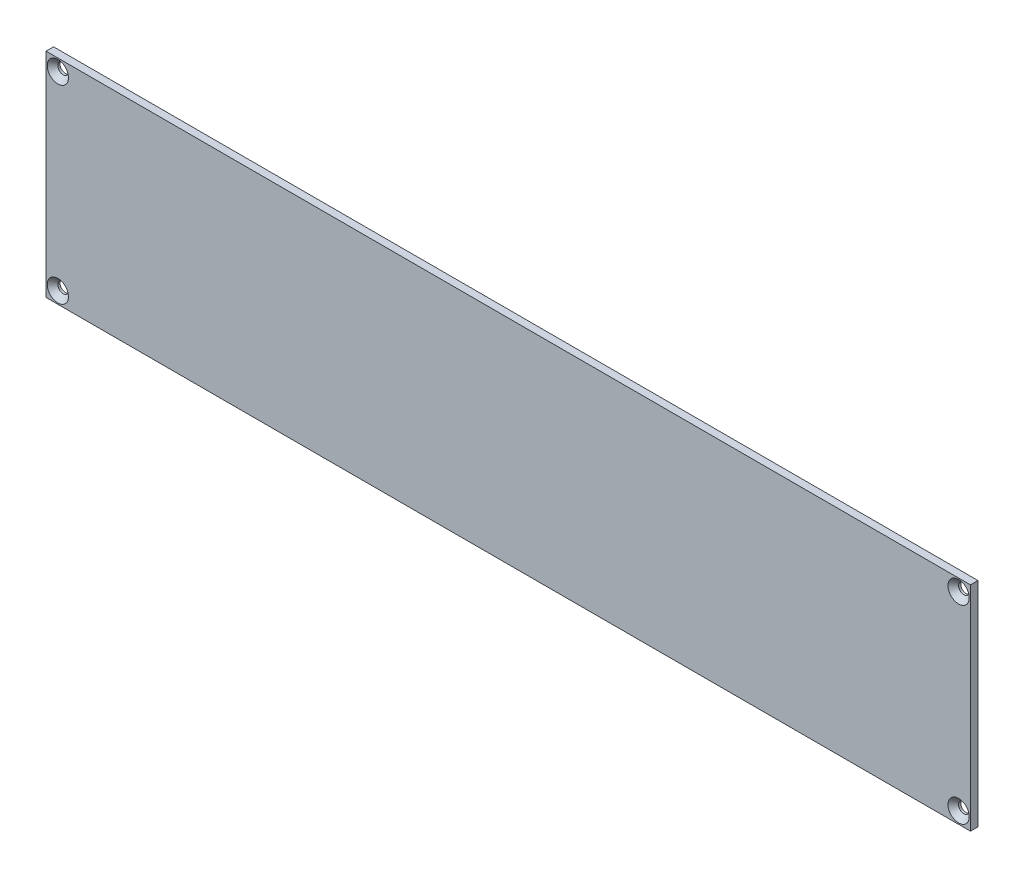
ISO-10303-21;
HEADER;
FILE_DESCRIPTION(('STEP AP214'),'2;1');
FILE_NAME('part.step','',(''),(''),'','','');
FILE_SCHEMA(('AUTOMOTIVE_DESIGN { 1 0 10303 214 1 1 1 1 }'));
ENDSEC;
DATA;
#1=APPLICATION_CONTEXT('core data for automotive mechanical design processes');
#2=APPLICATION_PROTOCOL_DEFINITION('international standard','automotive_design',2000,#1);
#3=PRODUCT_CONTEXT('',#1,'mechanical');
#4=PRODUCT('Part','Part','',(#3));
#5=PRODUCT_RELATED_PRODUCT_CATEGORY('part','',(#4));
#6=PRODUCT_DEFINITION_FORMATION('','',#4);
#7=PRODUCT_DEFINITION_CONTEXT('part definition',#1,'design');
#8=PRODUCT_DEFINITION('design','',#6,#7);
#9=PRODUCT_DEFINITION_SHAPE('','',#8);
#10=(LENGTH_UNIT() NAMED_UNIT(*) SI_UNIT(.MILLI.,.METRE.));
#11=(NAMED_UNIT(*) PLANE_ANGLE_UNIT() SI_UNIT($,.RADIAN.));
#12=(NAMED_UNIT(*) SI_UNIT($,.STERADIAN.) SOLID_ANGLE_UNIT());
#13=UNCERTAINTY_MEASURE_WITH_UNIT(LENGTH_MEASURE(1.E-05),#10,'distance_accuracy_value','');
#14=(GEOMETRIC_REPRESENTATION_CONTEXT(3) GLOBAL_UNCERTAINTY_ASSIGNED_CONTEXT((#13)) GLOBAL_UNIT_ASSIGNED_CONTEXT((#10,
#11,#12)) REPRESENTATION_CONTEXT('',''));
#15=CARTESIAN_POINT('',(0.,0.,0.));
#16=DIRECTION('',(0.,0.,1.));
#17=DIRECTION('',(1.,0.,0.));
#18=AXIS2_PLACEMENT_3D('',#15,#16,#17);
#19=CARTESIAN_POINT('',(195.,-45.,3.175));
#20=DIRECTION('',(-1.,0.,0.));
#21=DIRECTION('',(0.,0.,1.));
#22=AXIS2_PLACEMENT_3D('',#19,#20,#21);
#23=PLANE('',#22);
#24=DIRECTION('',(0.,1.,0.));
#25=VECTOR('',#24,1.);
#26=CARTESIAN_POINT('',(195.,-45.,0.));
#27=LINE('',#26,#25);
#28=CARTESIAN_POINT('',(195.,-45.,0.));
#29=VERTEX_POINT('',#28);
#30=CARTESIAN_POINT('',(195.,45.,0.));
#31=VERTEX_POINT('',#30);
#32=EDGE_CURVE('E107',#29,#31,#27,.T.);
#33=ORIENTED_EDGE('',*,*,#32,.T.);
#34=DIRECTION('',(0.,0.,-1.));
#35=VECTOR('',#34,1.);
#36=CARTESIAN_POINT('',(195.,45.,3.175));
#37=LINE('',#36,#35);
#38=CARTESIAN_POINT('',(195.,45.,3.175));
#39=VERTEX_POINT('',#38);
#40=EDGE_CURVE('E11',#39,#31,#37,.T.);
#41=ORIENTED_EDGE('',*,*,#40,.F.);
#42=DIRECTION('',(0.,1.,0.));
#43=VECTOR('',#42,1.);
#44=CARTESIAN_POINT('',(195.,-45.,3.175));
#45=LINE('',#44,#43);
#46=CARTESIAN_POINT('',(195.,-45.,3.175));
#47=VERTEX_POINT('',#46);
#48=EDGE_CURVE('E91',#47,#39,#45,.T.);
#49=ORIENTED_EDGE('',*,*,#48,.F.);
#50=DIRECTION('',(0.,0.,-1.));
#51=VECTOR('',#50,1.);
#52=CARTESIAN_POINT('',(195.,-45.,3.175));
#53=LINE('',#52,#51);
#54=EDGE_CURVE('E103',#47,#29,#53,.T.);
#55=ORIENTED_EDGE('',*,*,#54,.T.);
#56=EDGE_LOOP('',(#33,#41,#49,#55));
#57=FACE_BOUND('',#56,.T.);
#58=ADVANCED_FACE('F39',(#57),#23,.F.);
#59=CARTESIAN_POINT('',(-195.,45.,3.175));
#60=DIRECTION('',(0.,-1.,0.));
#61=DIRECTION('',(0.,0.,-1.));
#62=AXIS2_PLACEMENT_3D('',#59,#60,#61);
#63=PLANE('',#62);
#64=DIRECTION('',(-1.,0.,0.));
#65=VECTOR('',#64,1.);
#66=CARTESIAN_POINT('',(-195.,45.,0.));
#67=LINE('',#66,#65);
#68=CARTESIAN_POINT('',(-195.,45.,0.));
#69=VERTEX_POINT('',#68);
#70=EDGE_CURVE('E96',#31,#69,#67,.T.);
#71=ORIENTED_EDGE('',*,*,#70,.T.);
#72=DIRECTION('',(0.,0.,-1.));
#73=VECTOR('',#72,1.);
#74=CARTESIAN_POINT('',(-195.,45.,3.175));
#75=LINE('',#74,#73);
#76=CARTESIAN_POINT('',(-195.,45.,3.175));
#77=VERTEX_POINT('',#76);
#78=EDGE_CURVE('E48',#77,#69,#75,.T.);
#79=ORIENTED_EDGE('',*,*,#78,.F.);
#80=DIRECTION('',(-1.,0.,0.));
#81=VECTOR('',#80,1.);
#82=CARTESIAN_POINT('',(-195.,45.,3.175));
#83=LINE('',#82,#81);
#84=EDGE_CURVE('E86',#39,#77,#83,.T.);
#85=ORIENTED_EDGE('',*,*,#84,.F.);
#86=ORIENTED_EDGE('',*,*,#40,.T.);
#87=EDGE_LOOP('',(#71,#79,#85,#86));
#88=FACE_BOUND('',#87,.T.);
#89=ADVANCED_FACE('F95',(#88),#63,.F.);
#90=CARTESIAN_POINT('',(-195.,-45.,3.175));
#91=DIRECTION('',(1.,0.,0.));
#92=DIRECTION('',(0.,0.,-1.));
#93=AXIS2_PLACEMENT_3D('',#90,#91,#92);
#94=PLANE('',#93);
#95=DIRECTION('',(0.,-1.,0.));
#96=VECTOR('',#95,1.);
#97=CARTESIAN_POINT('',(-195.,-45.,0.));
#98=LINE('',#97,#96);
#99=CARTESIAN_POINT('',(-195.,-45.,0.));
#100=VERTEX_POINT('',#99);
#101=EDGE_CURVE('E73',#69,#100,#98,.T.);
#102=ORIENTED_EDGE('',*,*,#101,.T.);
#103=DIRECTION('',(0.,0.,-1.));
#104=VECTOR('',#103,1.);
#105=CARTESIAN_POINT('',(-195.,-45.,3.175));
#106=LINE('',#105,#104);
#107=CARTESIAN_POINT('',(-195.,-45.,3.175));
#108=VERTEX_POINT('',#107);
#109=EDGE_CURVE('E98',#108,#100,#106,.T.);
#110=ORIENTED_EDGE('',*,*,#109,.F.);
#111=DIRECTION('',(0.,-1.,0.));
#112=VECTOR('',#111,1.);
#113=CARTESIAN_POINT('',(-195.,-45.,3.175));
#114=LINE('',#113,#112);
#115=EDGE_CURVE('E89',#77,#108,#114,.T.);
#116=ORIENTED_EDGE('',*,*,#115,.F.);
#117=ORIENTED_EDGE('',*,*,#78,.T.);
#118=EDGE_LOOP('',(#102,#110,#116,#117));
#119=FACE_BOUND('',#118,.T.);
#120=ADVANCED_FACE('F99',(#119),#94,.F.);
#121=CARTESIAN_POINT('',(-195.,-45.,3.175));
#122=DIRECTION('',(0.,1.,0.));
#123=DIRECTION('',(0.,0.,1.));
#124=AXIS2_PLACEMENT_3D('',#121,#122,#123);
#125=PLANE('',#124);
#126=DIRECTION('',(1.,0.,0.));
#127=VECTOR('',#126,1.);
#128=CARTESIAN_POINT('',(-195.,-45.,0.));
#129=LINE('',#128,#127);
#130=EDGE_CURVE('E79',#100,#29,#129,.T.);
#131=ORIENTED_EDGE('',*,*,#130,.T.);
#132=ORIENTED_EDGE('',*,*,#54,.F.);
#133=DIRECTION('',(1.,0.,0.));
#134=VECTOR('',#133,1.);
#135=CARTESIAN_POINT('',(-195.,-45.,3.175));
#136=LINE('',#135,#134);
#137=EDGE_CURVE('E56',#108,#47,#136,.T.);
#138=ORIENTED_EDGE('',*,*,#137,.F.);
#139=ORIENTED_EDGE('',*,*,#109,.T.);
#140=EDGE_LOOP('',(#131,#132,#138,#139));
#141=FACE_BOUND('',#140,.T.);
#142=ADVANCED_FACE('F121',(#141),#125,.F.);
#143=CARTESIAN_POINT('',(0.,0.,3.175));
#144=DIRECTION('',(0.,0.,-1.));
#145=DIRECTION('',(-1.,0.,0.));
#146=AXIS2_PLACEMENT_3D('',#143,#144,#145);
#147=PLANE('',#146);
#148=CARTESIAN_POINT('',(190.,40.,3.175));
#149=DIRECTION('',(0.,0.,1.));
#150=DIRECTION('',(1.,0.,0.));
#151=AXIS2_PLACEMENT_3D('',#148,#149,#150);
#152=CIRCLE('',#151,4.48000000000001);
#153=CARTESIAN_POINT('',(194.48,40.,3.175));
#154=VERTEX_POINT('',#153);
#155=EDGE_CURVE('E171',#154,#154,#152,.T.);
#156=ORIENTED_EDGE('',*,*,#155,.F.);
#157=EDGE_LOOP('',(#156));
#158=FACE_BOUND('',#157,.T.);
#159=CARTESIAN_POINT('',(-190.,-40.0000000000001,3.175));
#160=DIRECTION('',(0.,0.,1.));
#161=DIRECTION('',(1.,0.,0.));
#162=AXIS2_PLACEMENT_3D('',#159,#160,#161);
#163=CIRCLE('',#162,4.48000000000001);
#164=CARTESIAN_POINT('',(-185.52,-40.0000000000001,3.175));
#165=VERTEX_POINT('',#164);
#166=EDGE_CURVE('E159',#165,#165,#163,.T.);
#167=ORIENTED_EDGE('',*,*,#166,.F.);
#168=EDGE_LOOP('',(#167));
#169=FACE_BOUND('',#168,.T.);
#170=CARTESIAN_POINT('',(-190.,40.,3.175));
#171=DIRECTION('',(0.,0.,1.));
#172=DIRECTION('',(1.,0.,0.));
#173=AXIS2_PLACEMENT_3D('',#170,#171,#172);
#174=CIRCLE('',#173,4.48000000000001);
#175=CARTESIAN_POINT('',(-185.52,40.,3.175));
#176=VERTEX_POINT('',#175);
#177=EDGE_CURVE('E147',#176,#176,#174,.T.);
#178=ORIENTED_EDGE('',*,*,#177,.F.);
#179=EDGE_LOOP('',(#178));
#180=FACE_BOUND('',#179,.T.);
#181=CARTESIAN_POINT('',(190.,-40.0000000000001,3.175));
#182=DIRECTION('',(0.,0.,1.));
#183=DIRECTION('',(1.,0.,0.));
#184=AXIS2_PLACEMENT_3D('',#181,#182,#183);
#185=CIRCLE('',#184,4.48000000000001);
#186=CARTESIAN_POINT('',(194.48,-40.0000000000001,3.175));
#187=VERTEX_POINT('',#186);
#188=EDGE_CURVE('E135',#187,#187,#185,.T.);
#189=ORIENTED_EDGE('',*,*,#188,.F.);
#190=EDGE_LOOP('',(#189));
#191=FACE_BOUND('',#190,.T.);
#192=ORIENTED_EDGE('',*,*,#48,.T.);
#193=ORIENTED_EDGE('',*,*,#84,.T.);
#194=ORIENTED_EDGE('',*,*,#115,.T.);
#195=ORIENTED_EDGE('',*,*,#137,.T.);
#196=EDGE_LOOP('',(#192,#193,#194,#195));
#197=FACE_BOUND('',#196,.T.);
#198=ADVANCED_FACE('F87',(#158,#169,#180,#191,#197),#147,.F.);
#199=CARTESIAN_POINT('',(0.,0.,0.));
#200=DIRECTION('',(0.,0.,-1.));
#201=DIRECTION('',(-1.,0.,0.));
#202=AXIS2_PLACEMENT_3D('',#199,#200,#201);
#203=PLANE('',#202);
#204=CARTESIAN_POINT('',(190.,40.,0.));
#205=DIRECTION('',(0.,0.,1.));
#206=DIRECTION('',(1.,0.,0.));
#207=AXIS2_PLACEMENT_3D('',#204,#205,#206);
#208=CIRCLE('',#207,2.25);
#209=CARTESIAN_POINT('',(192.25,40.,0.));
#210=VERTEX_POINT('',#209);
#211=EDGE_CURVE('E163',#210,#210,#208,.T.);
#212=ORIENTED_EDGE('',*,*,#211,.T.);
#213=EDGE_LOOP('',(#212));
#214=FACE_BOUND('',#213,.T.);
#215=CARTESIAN_POINT('',(-190.,-40.0000000000001,0.));
#216=DIRECTION('',(0.,0.,1.));
#217=DIRECTION('',(1.,0.,0.));
#218=AXIS2_PLACEMENT_3D('',#215,#216,#217);
#219=CIRCLE('',#218,2.25);
#220=CARTESIAN_POINT('',(-187.75,-40.0000000000001,0.));
#221=VERTEX_POINT('',#220);
#222=EDGE_CURVE('E151',#221,#221,#219,.T.);
#223=ORIENTED_EDGE('',*,*,#222,.T.);
#224=EDGE_LOOP('',(#223));
#225=FACE_BOUND('',#224,.T.);
#226=CARTESIAN_POINT('',(-190.,40.,0.));
#227=DIRECTION('',(0.,0.,1.));
#228=DIRECTION('',(1.,0.,0.));
#229=AXIS2_PLACEMENT_3D('',#226,#227,#228);
#230=CIRCLE('',#229,2.25);
#231=CARTESIAN_POINT('',(-187.75,40.,0.));
#232=VERTEX_POINT('',#231);
#233=EDGE_CURVE('E139',#232,#232,#230,.T.);
#234=ORIENTED_EDGE('',*,*,#233,.T.);
#235=EDGE_LOOP('',(#234));
#236=FACE_BOUND('',#235,.T.);
#237=CARTESIAN_POINT('',(190.,-40.0000000000001,0.));
#238=DIRECTION('',(0.,0.,1.));
#239=DIRECTION('',(1.,0.,0.));
#240=AXIS2_PLACEMENT_3D('',#237,#238,#239);
#241=CIRCLE('',#240,2.25);
#242=CARTESIAN_POINT('',(192.25,-40.0000000000001,0.));
#243=VERTEX_POINT('',#242);
#244=EDGE_CURVE('E111',#243,#243,#241,.T.);
#245=ORIENTED_EDGE('',*,*,#244,.T.);
#246=EDGE_LOOP('',(#245));
#247=FACE_BOUND('',#246,.T.);
#248=ORIENTED_EDGE('',*,*,#32,.F.);
#249=ORIENTED_EDGE('',*,*,#130,.F.);
#250=ORIENTED_EDGE('',*,*,#101,.F.);
#251=ORIENTED_EDGE('',*,*,#70,.F.);
#252=EDGE_LOOP('',(#248,#249,#250,#251));
#253=FACE_BOUND('',#252,.T.);
#254=ADVANCED_FACE('F124',(#214,#225,#236,#247,#253),#203,.T.);
#255=CARTESIAN_POINT('',(190.,-40.0000000000001,3.175));
#256=DIRECTION('',(0.,0.,1.));
#257=DIRECTION('',(1.,0.,0.));
#258=AXIS2_PLACEMENT_3D('',#255,#256,#257);
#259=CYLINDRICAL_SURFACE('',#258,2.25);
#260=ORIENTED_EDGE('',*,*,#244,.F.);
#261=EDGE_LOOP('',(#260));
#262=FACE_BOUND('',#261,.T.);
#263=CARTESIAN_POINT('',(190.,-40.0000000000001,0.944999999999999));
#264=DIRECTION('',(0.,0.,1.));
#265=DIRECTION('',(1.,0.,0.));
#266=AXIS2_PLACEMENT_3D('',#263,#264,#265);
#267=CIRCLE('',#266,2.25);
#268=CARTESIAN_POINT('',(192.25,-40.0000000000001,0.944999999999999));
#269=VERTEX_POINT('',#268);
#270=EDGE_CURVE('E131',#269,#269,#267,.T.);
#271=ORIENTED_EDGE('',*,*,#270,.T.);
#272=EDGE_LOOP('',(#271));
#273=FACE_BOUND('',#272,.T.);
#274=ADVANCED_FACE('F190',(#262,#273),#259,.F.);
#275=CARTESIAN_POINT('',(190.,-40.0000000000001,3.175));
#276=DIRECTION('',(0.,0.,1.));
#277=DIRECTION('',(1.,0.,0.));
#278=AXIS2_PLACEMENT_3D('',#275,#276,#277);
#279=CONICAL_SURFACE('',#278,4.48000000000001,0.78539816339745);
#280=ORIENTED_EDGE('',*,*,#270,.F.);
#281=EDGE_LOOP('',(#280));
#282=FACE_BOUND('',#281,.T.);
#283=ORIENTED_EDGE('',*,*,#188,.T.);
#284=EDGE_LOOP('',(#283));
#285=FACE_BOUND('',#284,.T.);
#286=ADVANCED_FACE('F187',(#282,#285),#279,.F.);
#287=CARTESIAN_POINT('',(-190.,40.,3.175));
#288=DIRECTION('',(0.,0.,1.));
#289=DIRECTION('',(1.,0.,0.));
#290=AXIS2_PLACEMENT_3D('',#287,#288,#289);
#291=CYLINDRICAL_SURFACE('',#290,2.25);
#292=ORIENTED_EDGE('',*,*,#233,.F.);
#293=EDGE_LOOP('',(#292));
#294=FACE_BOUND('',#293,.T.);
#295=CARTESIAN_POINT('',(-190.,40.,0.944999999999999));
#296=DIRECTION('',(0.,0.,1.));
#297=DIRECTION('',(1.,0.,0.));
#298=AXIS2_PLACEMENT_3D('',#295,#296,#297);
#299=CIRCLE('',#298,2.25);
#300=CARTESIAN_POINT('',(-187.75,40.,0.944999999999999));
#301=VERTEX_POINT('',#300);
#302=EDGE_CURVE('E143',#301,#301,#299,.T.);
#303=ORIENTED_EDGE('',*,*,#302,.T.);
#304=EDGE_LOOP('',(#303));
#305=FACE_BOUND('',#304,.T.);
#306=ADVANCED_FACE('F189',(#294,#305),#291,.F.);
#307=CARTESIAN_POINT('',(-190.,40.,3.175));
#308=DIRECTION('',(0.,0.,1.));
#309=DIRECTION('',(1.,0.,0.));
#310=AXIS2_PLACEMENT_3D('',#307,#308,#309);
#311=CONICAL_SURFACE('',#310,4.48000000000001,0.78539816339745);
#312=ORIENTED_EDGE('',*,*,#302,.F.);
#313=EDGE_LOOP('',(#312));
#314=FACE_BOUND('',#313,.T.);
#315=ORIENTED_EDGE('',*,*,#177,.T.);
#316=EDGE_LOOP('',(#315));
#317=FACE_BOUND('',#316,.T.);
#318=ADVANCED_FACE('F197',(#314,#317),#311,.F.);
#319=CARTESIAN_POINT('',(-190.,-40.0000000000001,3.175));
#320=DIRECTION('',(0.,0.,1.));
#321=DIRECTION('',(1.,0.,0.));
#322=AXIS2_PLACEMENT_3D('',#319,#320,#321);
#323=CYLINDRICAL_SURFACE('',#322,2.25);
#324=ORIENTED_EDGE('',*,*,#222,.F.);
#325=EDGE_LOOP('',(#324));
#326=FACE_BOUND('',#325,.T.);
#327=CARTESIAN_POINT('',(-190.,-40.0000000000001,0.944999999999999));
#328=DIRECTION('',(0.,0.,1.));
#329=DIRECTION('',(1.,0.,0.));
#330=AXIS2_PLACEMENT_3D('',#327,#328,#329);
#331=CIRCLE('',#330,2.25);
#332=CARTESIAN_POINT('',(-187.75,-40.0000000000001,0.944999999999999));
#333=VERTEX_POINT('',#332);
#334=EDGE_CURVE('E155',#333,#333,#331,.T.);
#335=ORIENTED_EDGE('',*,*,#334,.T.);
#336=EDGE_LOOP('',(#335));
#337=FACE_BOUND('',#336,.T.);
#338=ADVANCED_FACE('F231',(#326,#337),#323,.F.);
#339=CARTESIAN_POINT('',(-190.,-40.0000000000001,3.175));
#340=DIRECTION('',(0.,0.,1.));
#341=DIRECTION('',(1.,0.,0.));
#342=AXIS2_PLACEMENT_3D('',#339,#340,#341);
#343=CONICAL_SURFACE('',#342,4.48000000000001,0.78539816339745);
#344=ORIENTED_EDGE('',*,*,#334,.F.);
#345=EDGE_LOOP('',(#344));
#346=FACE_BOUND('',#345,.T.);
#347=ORIENTED_EDGE('',*,*,#166,.T.);
#348=EDGE_LOOP('',(#347));
#349=FACE_BOUND('',#348,.T.);
#350=ADVANCED_FACE('F236',(#346,#349),#343,.F.);
#351=CARTESIAN_POINT('',(190.,40.,3.175));
#352=DIRECTION('',(0.,0.,1.));
#353=DIRECTION('',(1.,0.,0.));
#354=AXIS2_PLACEMENT_3D('',#351,#352,#353);
#355=CYLINDRICAL_SURFACE('',#354,2.25);
#356=ORIENTED_EDGE('',*,*,#211,.F.);
#357=EDGE_LOOP('',(#356));
#358=FACE_BOUND('',#357,.T.);
#359=CARTESIAN_POINT('',(190.,40.,0.944999999999999));
#360=DIRECTION('',(0.,0.,1.));
#361=DIRECTION('',(1.,0.,0.));
#362=AXIS2_PLACEMENT_3D('',#359,#360,#361);
#363=CIRCLE('',#362,2.25);
#364=CARTESIAN_POINT('',(192.25,40.,0.944999999999999));
#365=VERTEX_POINT('',#364);
#366=EDGE_CURVE('E167',#365,#365,#363,.T.);
#367=ORIENTED_EDGE('',*,*,#366,.T.);
#368=EDGE_LOOP('',(#367));
#369=FACE_BOUND('',#368,.T.);
#370=ADVANCED_FACE('F242',(#358,#369),#355,.F.);
#371=CARTESIAN_POINT('',(190.,40.,3.175));
#372=DIRECTION('',(0.,0.,1.));
#373=DIRECTION('',(1.,0.,0.));
#374=AXIS2_PLACEMENT_3D('',#371,#372,#373);
#375=CONICAL_SURFACE('',#374,4.48000000000001,0.78539816339745);
#376=ORIENTED_EDGE('',*,*,#366,.F.);
#377=EDGE_LOOP('',(#376));
#378=FACE_BOUND('',#377,.T.);
#379=ORIENTED_EDGE('',*,*,#155,.T.);
#380=EDGE_LOOP('',(#379));
#381=FACE_BOUND('',#380,.T.);
#382=ADVANCED_FACE('F176',(#378,#381),#375,.F.);
#383=CLOSED_SHELL('',(#58,#89,#120,#142,#198,#254,#274,#286,#306,#318,#338,#350,#370,#382));
#384=MANIFOLD_SOLID_BREP('B2',#383);
#385=ADVANCED_BREP_SHAPE_REPRESENTATION('',(#18,#384),#14);
#386=SHAPE_DEFINITION_REPRESENTATION(#9,#385);
ENDSEC;
END-ISO-10303-21;
